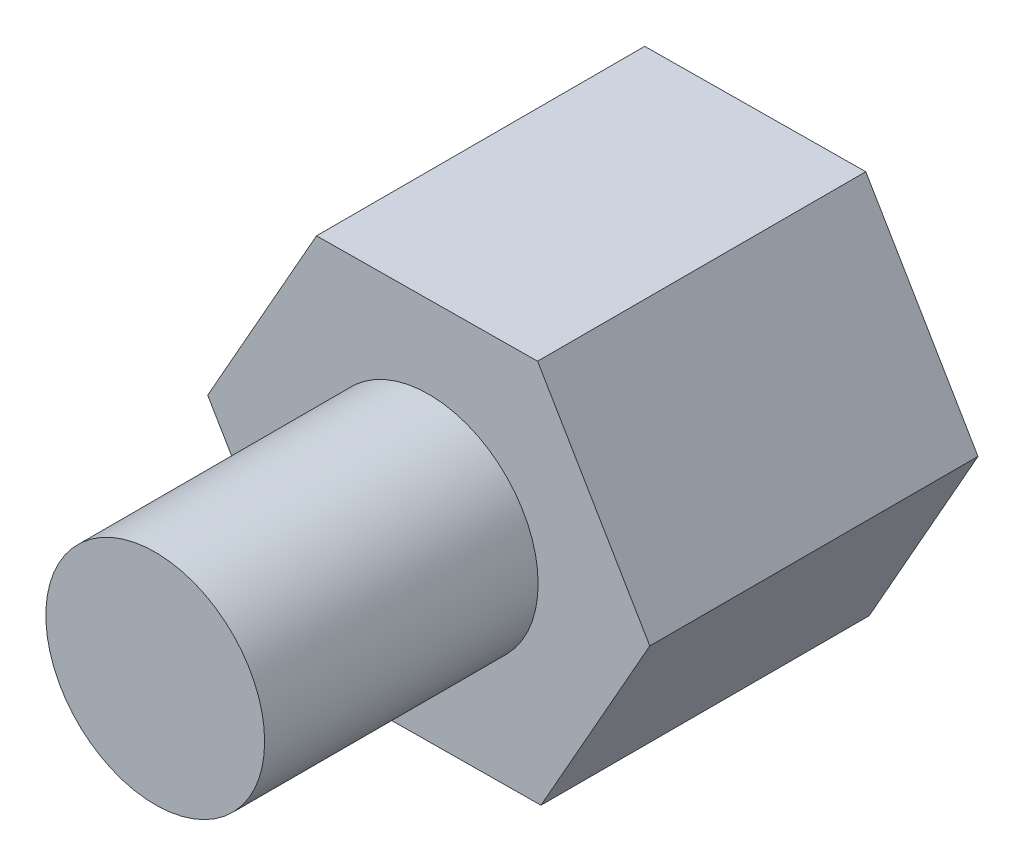
ISO-10303-21;
HEADER;
FILE_DESCRIPTION(('STEP AP214'),'2;1');
FILE_NAME('part.step','',(''),(''),'','','');
FILE_SCHEMA(('AUTOMOTIVE_DESIGN { 1 0 10303 214 1 1 1 1 }'));
ENDSEC;
DATA;
#1=APPLICATION_CONTEXT('core data for automotive mechanical design processes');
#2=APPLICATION_PROTOCOL_DEFINITION('international standard','automotive_design',2000,#1);
#3=PRODUCT_CONTEXT('',#1,'mechanical');
#4=PRODUCT('Part','Part','',(#3));
#5=PRODUCT_RELATED_PRODUCT_CATEGORY('part','',(#4));
#6=PRODUCT_DEFINITION_FORMATION('','',#4);
#7=PRODUCT_DEFINITION_CONTEXT('part definition',#1,'design');
#8=PRODUCT_DEFINITION('design','',#6,#7);
#9=PRODUCT_DEFINITION_SHAPE('','',#8);
#10=(LENGTH_UNIT() NAMED_UNIT(*) SI_UNIT(.MILLI.,.METRE.));
#11=(NAMED_UNIT(*) PLANE_ANGLE_UNIT() SI_UNIT($,.RADIAN.));
#12=(NAMED_UNIT(*) SI_UNIT($,.STERADIAN.) SOLID_ANGLE_UNIT());
#13=UNCERTAINTY_MEASURE_WITH_UNIT(LENGTH_MEASURE(1.E-05),#10,'distance_accuracy_value','');
#14=(GEOMETRIC_REPRESENTATION_CONTEXT(3) GLOBAL_UNCERTAINTY_ASSIGNED_CONTEXT((#13)) GLOBAL_UNIT_ASSIGNED_CONTEXT((#10,
#11,#12)) REPRESENTATION_CONTEXT('',''));
#15=CARTESIAN_POINT('',(0.,0.,0.));
#16=DIRECTION('',(0.,0.,1.));
#17=DIRECTION('',(1.,0.,0.));
#18=AXIS2_PLACEMENT_3D('',#15,#16,#17);
#19=CARTESIAN_POINT('',(0.,0.,11.));
#20=DIRECTION('',(0.,0.,-1.));
#21=DIRECTION('',(-1.,0.,0.));
#22=AXIS2_PLACEMENT_3D('',#19,#20,#21);
#23=CYLINDRICAL_SURFACE('',#22,2.);
#24=CARTESIAN_POINT('',(0.,0.,11.));
#25=DIRECTION('',(0.,0.,1.));
#26=DIRECTION('',(1.,0.,0.));
#27=AXIS2_PLACEMENT_3D('',#24,#25,#26);
#28=CIRCLE('',#27,2.);
#29=CARTESIAN_POINT('',(2.,0.,11.));
#30=VERTEX_POINT('',#29);
#31=EDGE_CURVE('E11',#30,#30,#28,.T.);
#32=ORIENTED_EDGE('',*,*,#31,.F.);
#33=EDGE_LOOP('',(#32));
#34=FACE_BOUND('',#33,.T.);
#35=CARTESIAN_POINT('',(0.,0.,6.));
#36=DIRECTION('',(0.,0.,1.));
#37=DIRECTION('',(1.,0.,0.));
#38=AXIS2_PLACEMENT_3D('',#35,#36,#37);
#39=CIRCLE('',#38,2.);
#40=CARTESIAN_POINT('',(2.,0.,6.));
#41=VERTEX_POINT('',#40);
#42=EDGE_CURVE('E50',#41,#41,#39,.T.);
#43=ORIENTED_EDGE('',*,*,#42,.T.);
#44=EDGE_LOOP('',(#43));
#45=FACE_BOUND('',#44,.T.);
#46=ADVANCED_FACE('F47',(#34,#45),#23,.T.);
#47=CARTESIAN_POINT('',(0.,0.,11.));
#48=DIRECTION('',(0.,0.,1.));
#49=DIRECTION('',(1.,0.,0.));
#50=AXIS2_PLACEMENT_3D('',#47,#48,#49);
#51=PLANE('',#50);
#52=ORIENTED_EDGE('',*,*,#31,.T.);
#53=EDGE_LOOP('',(#52));
#54=FACE_BOUND('',#53,.T.);
#55=ADVANCED_FACE('F62',(#54),#51,.T.);
#56=CARTESIAN_POINT('',(0.,0.,6.));
#57=DIRECTION('',(0.,0.,1.));
#58=DIRECTION('',(1.,0.,0.));
#59=AXIS2_PLACEMENT_3D('',#56,#57,#58);
#60=PLANE('',#59);
#61=ORIENTED_EDGE('',*,*,#42,.F.);
#62=EDGE_LOOP('',(#61));
#63=FACE_BOUND('',#62,.T.);
#64=ADVANCED_FACE('F60',(#63),#60,.F.);
#65=CLOSED_SHELL('',(#46,#55,#64));
#66=MANIFOLD_SOLID_BREP('B2',#65);
#67=CARTESIAN_POINT('',(0.,0.,6.));
#68=DIRECTION('',(0.,0.,1.));
#69=DIRECTION('',(1.,0.,0.));
#70=AXIS2_PLACEMENT_3D('',#67,#68,#69);
#71=PLANE('',#70);
#72=DIRECTION('',(0.999961257640527,0.00880245522430722,0.));
#73=VECTOR('',#72,1.);
#74=CARTESIAN_POINT('',(-1.98983906118775,-3.51765175136834,6.));
#75=LINE('',#74,#73);
#76=CARTESIAN_POINT('',(-1.98983906118775,-3.51765175136834,6.));
#77=VERTEX_POINT('',#76);
#78=CARTESIAN_POINT('',(2.05145624775792,-3.48207705211536,6.));
#79=VERTEX_POINT('',#78);
#80=EDGE_CURVE('E195',#77,#79,#75,.T.);
#81=ORIENTED_EDGE('',*,*,#80,.T.);
#82=DIRECTION('',(0.492357478980338,0.870393079529086,0.));
#83=VECTOR('',#82,1.);
#84=CARTESIAN_POINT('',(2.05145624775792,-3.48207705211536,6.));
#85=LINE('',#84,#83);
#86=CARTESIAN_POINT('',(4.04129530894568,0.0355746992529791,6.));
#87=VERTEX_POINT('',#86);
#88=EDGE_CURVE('E143',#79,#87,#85,.T.);
#89=ORIENTED_EDGE('',*,*,#88,.T.);
#90=DIRECTION('',(-0.507603778660189,0.861590624304779,0.));
#91=VECTOR('',#90,1.);
#92=CARTESIAN_POINT('',(4.04129530894568,0.0355746992529791,6.));
#93=LINE('',#92,#91);
#94=CARTESIAN_POINT('',(1.98983906118776,3.51765175136834,6.));
#95=VERTEX_POINT('',#94);
#96=EDGE_CURVE('E156',#87,#95,#93,.T.);
#97=ORIENTED_EDGE('',*,*,#96,.T.);
#98=DIRECTION('',(-0.999961257640527,-0.00880245522430723,0.));
#99=VECTOR('',#98,1.);
#100=CARTESIAN_POINT('',(1.98983906118776,3.51765175136834,6.));
#101=LINE('',#100,#99);
#102=CARTESIAN_POINT('',(-2.05145624775791,3.48207705211536,6.));
#103=VERTEX_POINT('',#102);
#104=EDGE_CURVE('E150',#95,#103,#101,.T.);
#105=ORIENTED_EDGE('',*,*,#104,.T.);
#106=DIRECTION('',(-0.492357478980338,-0.870393079529086,0.));
#107=VECTOR('',#106,1.);
#108=CARTESIAN_POINT('',(-2.05145624775791,3.48207705211536,6.));
#109=LINE('',#108,#107);
#110=CARTESIAN_POINT('',(-4.04129530894568,-0.0355746992529825,6.));
#111=VERTEX_POINT('',#110);
#112=EDGE_CURVE('E154',#103,#111,#109,.T.);
#113=ORIENTED_EDGE('',*,*,#112,.T.);
#114=DIRECTION('',(0.507603778660189,-0.861590624304779,0.));
#115=VECTOR('',#114,1.);
#116=CARTESIAN_POINT('',(-4.04129530894568,-0.0355746992529825,6.));
#117=LINE('',#116,#115);
#118=EDGE_CURVE('E106',#111,#77,#117,.T.);
#119=ORIENTED_EDGE('',*,*,#118,.T.);
#120=EDGE_LOOP('',(#81,#89,#97,#105,#113,#119));
#121=FACE_BOUND('',#120,.T.);
#122=CARTESIAN_POINT('',(0.,0.,6.));
#123=DIRECTION('',(0.,0.,1.));
#124=DIRECTION('',(1.,0.,0.));
#125=AXIS2_PLACEMENT_3D('',#122,#123,#124);
#126=CIRCLE('',#125,2.);
#127=CARTESIAN_POINT('',(2.,0.,6.));
#128=VERTEX_POINT('',#127);
#129=EDGE_CURVE('E183',#128,#128,#126,.T.);
#130=ORIENTED_EDGE('',*,*,#129,.F.);
#131=EDGE_LOOP('',(#130));
#132=FACE_BOUND('',#131,.T.);
#133=ADVANCED_FACE('F88',(#121,#132),#71,.T.);
#134=CARTESIAN_POINT('',(0.,0.,0.));
#135=DIRECTION('',(0.,0.,1.));
#136=DIRECTION('',(1.,0.,0.));
#137=AXIS2_PLACEMENT_3D('',#134,#135,#136);
#138=PLANE('',#137);
#139=DIRECTION('',(0.999961257640527,0.00880245522430722,0.));
#140=VECTOR('',#139,1.);
#141=CARTESIAN_POINT('',(-1.98983906118775,-3.51765175136834,0.));
#142=LINE('',#141,#140);
#143=CARTESIAN_POINT('',(-1.98983906118775,-3.51765175136834,0.));
#144=VERTEX_POINT('',#143);
#145=CARTESIAN_POINT('',(2.05145624775792,-3.48207705211536,0.));
#146=VERTEX_POINT('',#145);
#147=EDGE_CURVE('E178',#144,#146,#142,.T.);
#148=ORIENTED_EDGE('',*,*,#147,.F.);
#149=DIRECTION('',(0.507603778660189,-0.861590624304779,0.));
#150=VECTOR('',#149,1.);
#151=CARTESIAN_POINT('',(-4.04129530894568,-0.0355746992529825,0.));
#152=LINE('',#151,#150);
#153=CARTESIAN_POINT('',(-4.04129530894568,-0.0355746992529825,0.));
#154=VERTEX_POINT('',#153);
#155=EDGE_CURVE('E135',#154,#144,#152,.T.);
#156=ORIENTED_EDGE('',*,*,#155,.F.);
#157=DIRECTION('',(-0.492357478980338,-0.870393079529086,0.));
#158=VECTOR('',#157,1.);
#159=CARTESIAN_POINT('',(-2.05145624775791,3.48207705211536,0.));
#160=LINE('',#159,#158);
#161=CARTESIAN_POINT('',(-2.05145624775791,3.48207705211536,0.));
#162=VERTEX_POINT('',#161);
#163=EDGE_CURVE('E129',#162,#154,#160,.T.);
#164=ORIENTED_EDGE('',*,*,#163,.F.);
#165=DIRECTION('',(-0.999961257640527,-0.00880245522430723,0.));
#166=VECTOR('',#165,1.);
#167=CARTESIAN_POINT('',(1.98983906118776,3.51765175136834,0.));
#168=LINE('',#167,#166);
#169=CARTESIAN_POINT('',(1.98983906118776,3.51765175136834,0.));
#170=VERTEX_POINT('',#169);
#171=EDGE_CURVE('E165',#170,#162,#168,.T.);
#172=ORIENTED_EDGE('',*,*,#171,.F.);
#173=DIRECTION('',(-0.507603778660189,0.861590624304779,0.));
#174=VECTOR('',#173,1.);
#175=CARTESIAN_POINT('',(4.04129530894568,0.0355746992529791,0.));
#176=LINE('',#175,#174);
#177=CARTESIAN_POINT('',(4.04129530894568,0.0355746992529791,0.));
#178=VERTEX_POINT('',#177);
#179=EDGE_CURVE('E186',#178,#170,#176,.T.);
#180=ORIENTED_EDGE('',*,*,#179,.F.);
#181=DIRECTION('',(0.492357478980338,0.870393079529086,0.));
#182=VECTOR('',#181,1.);
#183=CARTESIAN_POINT('',(2.05145624775792,-3.48207705211536,0.));
#184=LINE('',#183,#182);
#185=EDGE_CURVE('E182',#146,#178,#184,.T.);
#186=ORIENTED_EDGE('',*,*,#185,.F.);
#187=EDGE_LOOP('',(#148,#156,#164,#172,#180,#186));
#188=FACE_BOUND('',#187,.T.);
#189=CARTESIAN_POINT('',(0.,0.,0.));
#190=DIRECTION('',(0.,0.,1.));
#191=DIRECTION('',(1.,0.,0.));
#192=AXIS2_PLACEMENT_3D('',#189,#190,#191);
#193=CIRCLE('',#192,2.);
#194=CARTESIAN_POINT('',(2.,0.,0.));
#195=VERTEX_POINT('',#194);
#196=EDGE_CURVE('E292',#195,#195,#193,.T.);
#197=ORIENTED_EDGE('',*,*,#196,.T.);
#198=EDGE_LOOP('',(#197));
#199=FACE_BOUND('',#198,.T.);
#200=ADVANCED_FACE('F208',(#188,#199),#138,.F.);
#201=CARTESIAN_POINT('',(-1.98983906118775,-3.51765175136834,6.));
#202=DIRECTION('',(-0.00880245522430722,0.999961257640527,0.));
#203=DIRECTION('',(-0.999961257640527,-0.00880245522430722,0.));
#204=AXIS2_PLACEMENT_3D('',#201,#202,#203);
#205=PLANE('',#204);
#206=ORIENTED_EDGE('',*,*,#147,.T.);
#207=DIRECTION('',(0.,0.,-1.));
#208=VECTOR('',#207,1.);
#209=CARTESIAN_POINT('',(2.05145624775792,-3.48207705211536,6.));
#210=LINE('',#209,#208);
#211=EDGE_CURVE('E45',#79,#146,#210,.T.);
#212=ORIENTED_EDGE('',*,*,#211,.F.);
#213=ORIENTED_EDGE('',*,*,#80,.F.);
#214=DIRECTION('',(0.,0.,-1.));
#215=VECTOR('',#214,1.);
#216=CARTESIAN_POINT('',(-1.98983906118775,-3.51765175136834,6.));
#217=LINE('',#216,#215);
#218=EDGE_CURVE('E174',#77,#144,#217,.T.);
#219=ORIENTED_EDGE('',*,*,#218,.T.);
#220=EDGE_LOOP('',(#206,#212,#213,#219));
#221=FACE_BOUND('',#220,.T.);
#222=ADVANCED_FACE('F90',(#221),#205,.F.);
#223=CARTESIAN_POINT('',(2.05145624775792,-3.48207705211536,6.));
#224=DIRECTION('',(-0.870393079529086,0.492357478980338,0.));
#225=DIRECTION('',(-0.492357478980338,-0.870393079529086,0.));
#226=AXIS2_PLACEMENT_3D('',#223,#224,#225);
#227=PLANE('',#226);
#228=ORIENTED_EDGE('',*,*,#185,.T.);
#229=DIRECTION('',(0.,0.,-1.));
#230=VECTOR('',#229,1.);
#231=CARTESIAN_POINT('',(4.04129530894568,0.0355746992529791,6.));
#232=LINE('',#231,#230);
#233=EDGE_CURVE('E98',#87,#178,#232,.T.);
#234=ORIENTED_EDGE('',*,*,#233,.F.);
#235=ORIENTED_EDGE('',*,*,#88,.F.);
#236=ORIENTED_EDGE('',*,*,#211,.T.);
#237=EDGE_LOOP('',(#228,#234,#235,#236));
#238=FACE_BOUND('',#237,.T.);
#239=ADVANCED_FACE('F233',(#238),#227,.F.);
#240=CARTESIAN_POINT('',(4.04129530894568,0.0355746992529791,6.));
#241=DIRECTION('',(-0.861590624304778,-0.507603778660189,0.));
#242=DIRECTION('',(0.507603778660189,-0.861590624304779,0.));
#243=AXIS2_PLACEMENT_3D('',#240,#241,#242);
#244=PLANE('',#243);
#245=ORIENTED_EDGE('',*,*,#179,.T.);
#246=DIRECTION('',(0.,0.,-1.));
#247=VECTOR('',#246,1.);
#248=CARTESIAN_POINT('',(1.98983906118776,3.51765175136834,6.));
#249=LINE('',#248,#247);
#250=EDGE_CURVE('E167',#95,#170,#249,.T.);
#251=ORIENTED_EDGE('',*,*,#250,.F.);
#252=ORIENTED_EDGE('',*,*,#96,.F.);
#253=ORIENTED_EDGE('',*,*,#233,.T.);
#254=EDGE_LOOP('',(#245,#251,#252,#253));
#255=FACE_BOUND('',#254,.T.);
#256=ADVANCED_FACE('F205',(#255),#244,.F.);
#257=CARTESIAN_POINT('',(1.98983906118776,3.51765175136834,6.));
#258=DIRECTION('',(0.00880245522430723,-0.999961257640527,0.));
#259=DIRECTION('',(0.999961257640527,0.00880245522430723,0.));
#260=AXIS2_PLACEMENT_3D('',#257,#258,#259);
#261=PLANE('',#260);
#262=ORIENTED_EDGE('',*,*,#171,.T.);
#263=DIRECTION('',(0.,0.,-1.));
#264=VECTOR('',#263,1.);
#265=CARTESIAN_POINT('',(-2.05145624775791,3.48207705211536,6.));
#266=LINE('',#265,#264);
#267=EDGE_CURVE('E162',#103,#162,#266,.T.);
#268=ORIENTED_EDGE('',*,*,#267,.F.);
#269=ORIENTED_EDGE('',*,*,#104,.F.);
#270=ORIENTED_EDGE('',*,*,#250,.T.);
#271=EDGE_LOOP('',(#262,#268,#269,#270));
#272=FACE_BOUND('',#271,.T.);
#273=ADVANCED_FACE('F163',(#272),#261,.F.);
#274=CARTESIAN_POINT('',(-2.05145624775791,3.48207705211536,6.));
#275=DIRECTION('',(0.870393079529086,-0.492357478980338,0.));
#276=DIRECTION('',(0.492357478980338,0.870393079529086,0.));
#277=AXIS2_PLACEMENT_3D('',#274,#275,#276);
#278=PLANE('',#277);
#279=ORIENTED_EDGE('',*,*,#163,.T.);
#280=DIRECTION('',(0.,0.,-1.));
#281=VECTOR('',#280,1.);
#282=CARTESIAN_POINT('',(-4.04129530894568,-0.0355746992529825,6.));
#283=LINE('',#282,#281);
#284=EDGE_CURVE('E168',#111,#154,#283,.T.);
#285=ORIENTED_EDGE('',*,*,#284,.F.);
#286=ORIENTED_EDGE('',*,*,#112,.F.);
#287=ORIENTED_EDGE('',*,*,#267,.T.);
#288=EDGE_LOOP('',(#279,#285,#286,#287));
#289=FACE_BOUND('',#288,.T.);
#290=ADVANCED_FACE('F170',(#289),#278,.F.);
#291=CARTESIAN_POINT('',(-4.04129530894568,-0.0355746992529825,6.));
#292=DIRECTION('',(0.861590624304779,0.507603778660189,0.));
#293=DIRECTION('',(-0.507603778660189,0.861590624304779,0.));
#294=AXIS2_PLACEMENT_3D('',#291,#292,#293);
#295=PLANE('',#294);
#296=ORIENTED_EDGE('',*,*,#155,.T.);
#297=ORIENTED_EDGE('',*,*,#218,.F.);
#298=ORIENTED_EDGE('',*,*,#118,.F.);
#299=ORIENTED_EDGE('',*,*,#284,.T.);
#300=EDGE_LOOP('',(#296,#297,#298,#299));
#301=FACE_BOUND('',#300,.T.);
#302=ADVANCED_FACE('F213',(#301),#295,.F.);
#303=CARTESIAN_POINT('',(0.,0.,6.));
#304=DIRECTION('',(0.,0.,-1.));
#305=DIRECTION('',(-1.,0.,0.));
#306=AXIS2_PLACEMENT_3D('',#303,#304,#305);
#307=CYLINDRICAL_SURFACE('',#306,2.);
#308=ORIENTED_EDGE('',*,*,#129,.T.);
#309=EDGE_LOOP('',(#308));
#310=FACE_BOUND('',#309,.T.);
#311=ORIENTED_EDGE('',*,*,#196,.F.);
#312=EDGE_LOOP('',(#311));
#313=FACE_BOUND('',#312,.T.);
#314=ADVANCED_FACE('F215',(#310,#313),#307,.F.);
#315=CLOSED_SHELL('',(#133,#200,#222,#239,#256,#273,#290,#302,#314));
#316=MANIFOLD_SOLID_BREP('B6',#315);
#317=ADVANCED_BREP_SHAPE_REPRESENTATION('',(#18,#66,#316),#14);
#318=SHAPE_DEFINITION_REPRESENTATION(#9,#317);
ENDSEC;
END-ISO-10303-21;
